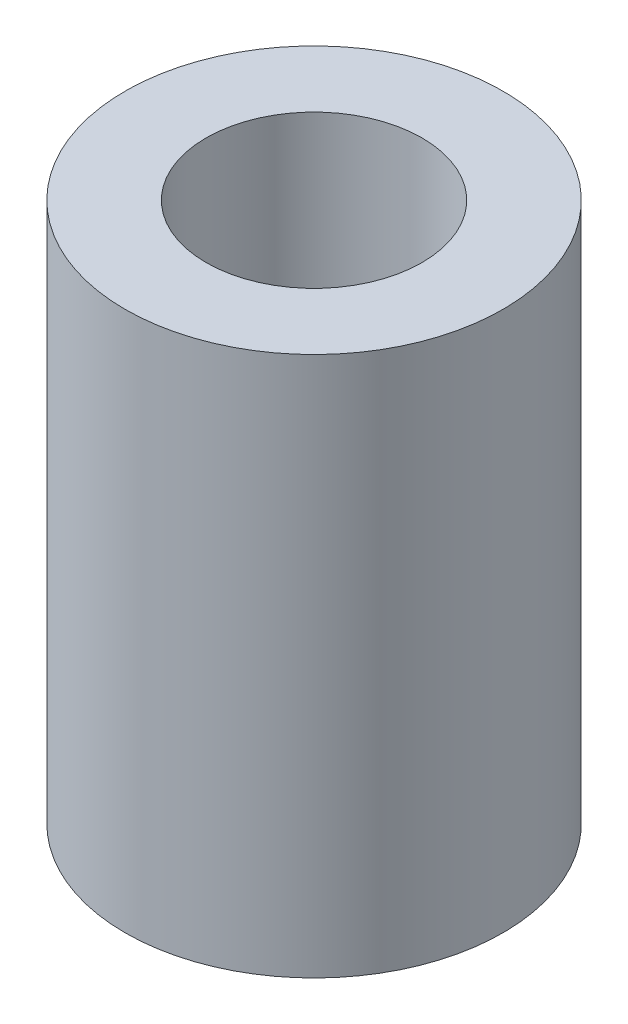
ISO-10303-21;
HEADER;
FILE_DESCRIPTION(('STEP AP214'),'2;1');
FILE_NAME('part.step','',(''),(''),'','','');
FILE_SCHEMA(('AUTOMOTIVE_DESIGN { 1 0 10303 214 1 1 1 1 }'));
ENDSEC;
DATA;
#1=APPLICATION_CONTEXT('core data for automotive mechanical design processes');
#2=APPLICATION_PROTOCOL_DEFINITION('international standard','automotive_design',2000,#1);
#3=PRODUCT_CONTEXT('',#1,'mechanical');
#4=PRODUCT('Part','Part','',(#3));
#5=PRODUCT_RELATED_PRODUCT_CATEGORY('part','',(#4));
#6=PRODUCT_DEFINITION_FORMATION('','',#4);
#7=PRODUCT_DEFINITION_CONTEXT('part definition',#1,'design');
#8=PRODUCT_DEFINITION('design','',#6,#7);
#9=PRODUCT_DEFINITION_SHAPE('','',#8);
#10=(LENGTH_UNIT() NAMED_UNIT(*) SI_UNIT(.MILLI.,.METRE.));
#11=(NAMED_UNIT(*) PLANE_ANGLE_UNIT() SI_UNIT($,.RADIAN.));
#12=(NAMED_UNIT(*) SI_UNIT($,.STERADIAN.) SOLID_ANGLE_UNIT());
#13=UNCERTAINTY_MEASURE_WITH_UNIT(LENGTH_MEASURE(1.E-05),#10,'distance_accuracy_value','');
#14=(GEOMETRIC_REPRESENTATION_CONTEXT(3) GLOBAL_UNCERTAINTY_ASSIGNED_CONTEXT((#13)) GLOBAL_UNIT_ASSIGNED_CONTEXT((#10,
#11,#12)) REPRESENTATION_CONTEXT('',''));
#15=CARTESIAN_POINT('',(0.,0.,0.));
#16=DIRECTION('',(0.,0.,1.));
#17=DIRECTION('',(1.,0.,0.));
#18=AXIS2_PLACEMENT_3D('',#15,#16,#17);
#19=CARTESIAN_POINT('',(0.,10.,0.));
#20=DIRECTION('',(0.,1.,0.));
#21=DIRECTION('',(0.,0.,1.));
#22=AXIS2_PLACEMENT_3D('',#19,#20,#21);
#23=PLANE('',#22);
#24=CARTESIAN_POINT('',(0.,10.,0.));
#25=DIRECTION('',(0.,1.,0.));
#26=DIRECTION('',(0.,0.,1.));
#27=AXIS2_PLACEMENT_3D('',#24,#25,#26);
#28=CIRCLE('',#27,3.5);
#29=CARTESIAN_POINT('',(0.,10.,3.5));
#30=VERTEX_POINT('',#29);
#31=EDGE_CURVE('E10',#30,#30,#28,.T.);
#32=ORIENTED_EDGE('',*,*,#31,.T.);
#33=EDGE_LOOP('',(#32));
#34=FACE_BOUND('',#33,.T.);
#35=CARTESIAN_POINT('',(0.,10.,0.));
#36=DIRECTION('',(0.,1.,0.));
#37=DIRECTION('',(0.,0.,1.));
#38=AXIS2_PLACEMENT_3D('',#35,#36,#37);
#39=CIRCLE('',#38,2.);
#40=CARTESIAN_POINT('',(0.,10.,2.));
#41=VERTEX_POINT('',#40);
#42=EDGE_CURVE('E43',#41,#41,#39,.T.);
#43=ORIENTED_EDGE('',*,*,#42,.F.);
#44=EDGE_LOOP('',(#43));
#45=FACE_BOUND('',#44,.T.);
#46=ADVANCED_FACE('F32',(#34,#45),#23,.T.);
#47=CARTESIAN_POINT('',(0.,0.,0.));
#48=DIRECTION('',(0.,1.,0.));
#49=DIRECTION('',(0.,0.,1.));
#50=AXIS2_PLACEMENT_3D('',#47,#48,#49);
#51=PLANE('',#50);
#52=CARTESIAN_POINT('',(0.,0.,0.));
#53=DIRECTION('',(0.,1.,0.));
#54=DIRECTION('',(0.,0.,1.));
#55=AXIS2_PLACEMENT_3D('',#52,#53,#54);
#56=CIRCLE('',#55,3.5);
#57=CARTESIAN_POINT('',(0.,0.,3.5));
#58=VERTEX_POINT('',#57);
#59=EDGE_CURVE('E36',#58,#58,#56,.T.);
#60=ORIENTED_EDGE('',*,*,#59,.F.);
#61=EDGE_LOOP('',(#60));
#62=FACE_BOUND('',#61,.T.);
#63=CARTESIAN_POINT('',(0.,0.,0.));
#64=DIRECTION('',(0.,1.,0.));
#65=DIRECTION('',(0.,0.,1.));
#66=AXIS2_PLACEMENT_3D('',#63,#64,#65);
#67=CIRCLE('',#66,2.);
#68=CARTESIAN_POINT('',(0.,0.,2.));
#69=VERTEX_POINT('',#68);
#70=EDGE_CURVE('E45',#69,#69,#67,.T.);
#71=ORIENTED_EDGE('',*,*,#70,.T.);
#72=EDGE_LOOP('',(#71));
#73=FACE_BOUND('',#72,.T.);
#74=ADVANCED_FACE('F55',(#62,#73),#51,.F.);
#75=CARTESIAN_POINT('',(0.,10.,0.));
#76=DIRECTION('',(0.,-1.,0.));
#77=DIRECTION('',(0.,0.,-1.));
#78=AXIS2_PLACEMENT_3D('',#75,#76,#77);
#79=CYLINDRICAL_SURFACE('',#78,3.5);
#80=ORIENTED_EDGE('',*,*,#31,.F.);
#81=EDGE_LOOP('',(#80));
#82=FACE_BOUND('',#81,.T.);
#83=ORIENTED_EDGE('',*,*,#59,.T.);
#84=EDGE_LOOP('',(#83));
#85=FACE_BOUND('',#84,.T.);
#86=ADVANCED_FACE('F34',(#82,#85),#79,.T.);
#87=CARTESIAN_POINT('',(0.,10.,0.));
#88=DIRECTION('',(0.,-1.,0.));
#89=DIRECTION('',(0.,0.,-1.));
#90=AXIS2_PLACEMENT_3D('',#87,#88,#89);
#91=CYLINDRICAL_SURFACE('',#90,2.);
#92=ORIENTED_EDGE('',*,*,#42,.T.);
#93=EDGE_LOOP('',(#92));
#94=FACE_BOUND('',#93,.T.);
#95=ORIENTED_EDGE('',*,*,#70,.F.);
#96=EDGE_LOOP('',(#95));
#97=FACE_BOUND('',#96,.T.);
#98=ADVANCED_FACE('F51',(#94,#97),#91,.F.);
#99=CLOSED_SHELL('',(#46,#74,#86,#98));
#100=MANIFOLD_SOLID_BREP('B2',#99);
#101=ADVANCED_BREP_SHAPE_REPRESENTATION('',(#18,#100),#14);
#102=SHAPE_DEFINITION_REPRESENTATION(#9,#101);
ENDSEC;
END-ISO-10303-21;
